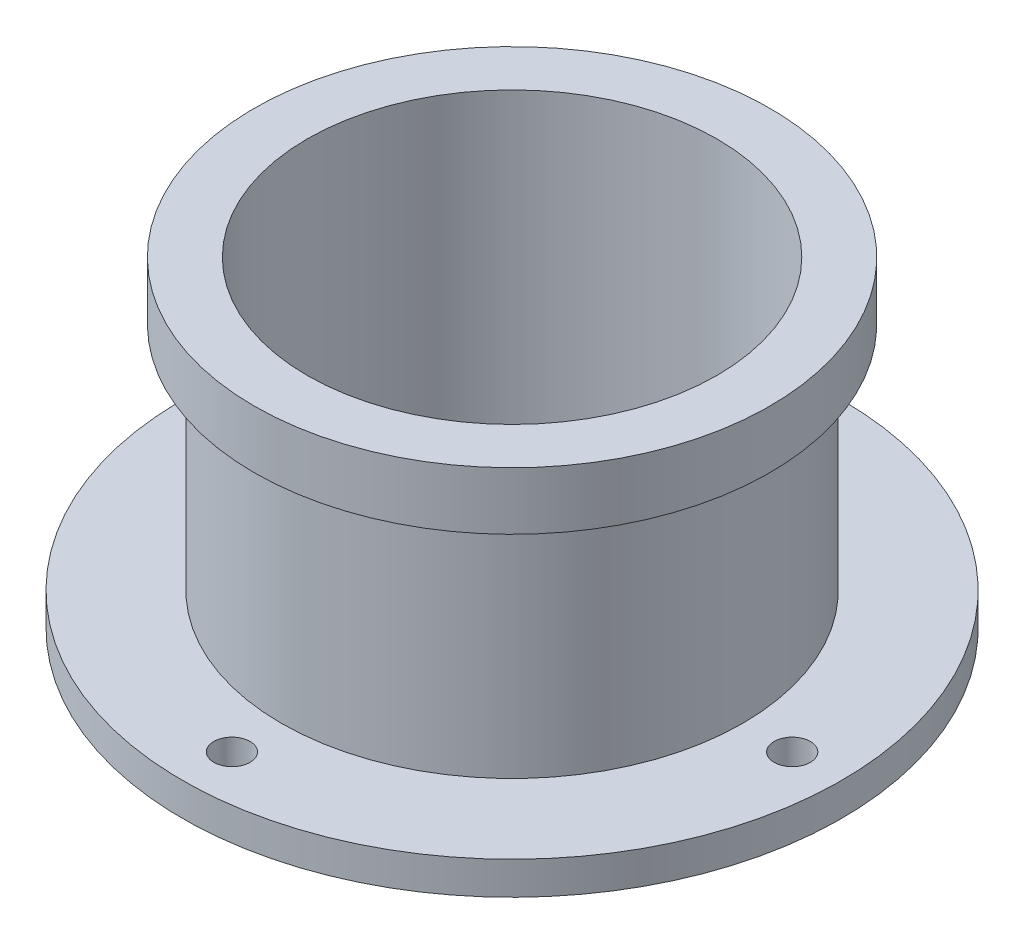
ISO-10303-21;
HEADER;
FILE_DESCRIPTION(('STEP AP214'),'2;1');
FILE_NAME('part.step','',(''),(''),'','','');
FILE_SCHEMA(('AUTOMOTIVE_DESIGN { 1 0 10303 214 1 1 1 1 }'));
ENDSEC;
DATA;
#1=APPLICATION_CONTEXT('core data for automotive mechanical design processes');
#2=APPLICATION_PROTOCOL_DEFINITION('international standard','automotive_design',2000,#1);
#3=PRODUCT_CONTEXT('',#1,'mechanical');
#4=PRODUCT('Part','Part','',(#3));
#5=PRODUCT_RELATED_PRODUCT_CATEGORY('part','',(#4));
#6=PRODUCT_DEFINITION_FORMATION('','',#4);
#7=PRODUCT_DEFINITION_CONTEXT('part definition',#1,'design');
#8=PRODUCT_DEFINITION('design','',#6,#7);
#9=PRODUCT_DEFINITION_SHAPE('','',#8);
#10=(LENGTH_UNIT() NAMED_UNIT(*) SI_UNIT(.MILLI.,.METRE.));
#11=(NAMED_UNIT(*) PLANE_ANGLE_UNIT() SI_UNIT($,.RADIAN.));
#12=(NAMED_UNIT(*) SI_UNIT($,.STERADIAN.) SOLID_ANGLE_UNIT());
#13=UNCERTAINTY_MEASURE_WITH_UNIT(LENGTH_MEASURE(1.E-05),#10,'distance_accuracy_value','');
#14=(GEOMETRIC_REPRESENTATION_CONTEXT(3) GLOBAL_UNCERTAINTY_ASSIGNED_CONTEXT((#13)) GLOBAL_UNIT_ASSIGNED_CONTEXT((#10,
#11,#12)) REPRESENTATION_CONTEXT('',''));
#15=CARTESIAN_POINT('',(0.,0.,0.));
#16=DIRECTION('',(0.,0.,1.));
#17=DIRECTION('',(1.,0.,0.));
#18=AXIS2_PLACEMENT_3D('',#15,#16,#17);
#19=CARTESIAN_POINT('',(0.,9.,0.));
#20=DIRECTION('',(0.,-1.,0.));
#21=DIRECTION('',(0.,0.,-1.));
#22=AXIS2_PLACEMENT_3D('',#19,#20,#21);
#23=CYLINDRICAL_SURFACE('',#22,31.0832015946794);
#24=CARTESIAN_POINT('',(0.,8.75,0.));
#25=DIRECTION('',(0.,1.,0.));
#26=DIRECTION('',(0.,0.,1.));
#27=AXIS2_PLACEMENT_3D('',#24,#25,#26);
#28=CIRCLE('',#27,31.0832015946794);
#29=CARTESIAN_POINT('',(0.,8.75,31.0832015946794));
#30=VERTEX_POINT('',#29);
#31=EDGE_CURVE('E73',#30,#30,#28,.T.);
#32=ORIENTED_EDGE('',*,*,#31,.T.);
#33=EDGE_LOOP('',(#32));
#34=FACE_BOUND('',#33,.T.);
#35=CARTESIAN_POINT('',(0.,-40.,0.));
#36=DIRECTION('',(0.,1.,0.));
#37=DIRECTION('',(0.,0.,1.));
#38=AXIS2_PLACEMENT_3D('',#35,#36,#37);
#39=CIRCLE('',#38,31.0832015946794);
#40=CARTESIAN_POINT('',(0.,-40.,31.0832015946794));
#41=VERTEX_POINT('',#40);
#42=EDGE_CURVE('E164',#41,#41,#39,.T.);
#43=ORIENTED_EDGE('',*,*,#42,.F.);
#44=EDGE_LOOP('',(#43));
#45=FACE_BOUND('',#44,.T.);
#46=ADVANCED_FACE('F46',(#34,#45),#23,.F.);
#47=CARTESIAN_POINT('',(0.,-40.,0.));
#48=DIRECTION('',(0.,1.,0.));
#49=DIRECTION('',(0.,0.,1.));
#50=AXIS2_PLACEMENT_3D('',#47,#48,#49);
#51=CYLINDRICAL_SURFACE('',#50,35.);
#52=CARTESIAN_POINT('',(0.,0.,0.));
#53=DIRECTION('',(0.,-1.,0.));
#54=DIRECTION('',(0.,0.,-1.));
#55=AXIS2_PLACEMENT_3D('',#52,#53,#54);
#56=CIRCLE('',#55,35.);
#57=CARTESIAN_POINT('',(0.,0.,-35.));
#58=VERTEX_POINT('',#57);
#59=EDGE_CURVE('E54',#58,#58,#56,.T.);
#60=ORIENTED_EDGE('',*,*,#59,.T.);
#61=EDGE_LOOP('',(#60));
#62=FACE_BOUND('',#61,.T.);
#63=CARTESIAN_POINT('',(0.,-35.,0.));
#64=DIRECTION('',(0.,-1.,0.));
#65=DIRECTION('',(0.,0.,-1.));
#66=AXIS2_PLACEMENT_3D('',#63,#64,#65);
#67=CIRCLE('',#66,35.);
#68=CARTESIAN_POINT('',(0.,-35.,-35.));
#69=VERTEX_POINT('',#68);
#70=EDGE_CURVE('E10',#69,#69,#67,.T.);
#71=ORIENTED_EDGE('',*,*,#70,.F.);
#72=EDGE_LOOP('',(#71));
#73=FACE_BOUND('',#72,.T.);
#74=ADVANCED_FACE('F96',(#62,#73),#51,.T.);
#75=CARTESIAN_POINT('',(0.,8.75,0.));
#76=DIRECTION('',(0.,-1.,0.));
#77=DIRECTION('',(0.,0.,-1.));
#78=AXIS2_PLACEMENT_3D('',#75,#76,#77);
#79=CYLINDRICAL_SURFACE('',#78,39.125);
#80=CARTESIAN_POINT('',(0.,8.75,0.));
#81=DIRECTION('',(0.,1.,0.));
#82=DIRECTION('',(0.,0.,1.));
#83=AXIS2_PLACEMENT_3D('',#80,#81,#82);
#84=CIRCLE('',#83,39.125);
#85=CARTESIAN_POINT('',(0.,8.75,39.125));
#86=VERTEX_POINT('',#85);
#87=EDGE_CURVE('E60',#86,#86,#84,.T.);
#88=ORIENTED_EDGE('',*,*,#87,.F.);
#89=EDGE_LOOP('',(#88));
#90=FACE_BOUND('',#89,.T.);
#91=CARTESIAN_POINT('',(0.,0.,0.));
#92=DIRECTION('',(0.,1.,0.));
#93=DIRECTION('',(0.,0.,1.));
#94=AXIS2_PLACEMENT_3D('',#91,#92,#93);
#95=CIRCLE('',#94,39.125);
#96=CARTESIAN_POINT('',(0.,0.,39.125));
#97=VERTEX_POINT('',#96);
#98=EDGE_CURVE('E67',#97,#97,#95,.T.);
#99=ORIENTED_EDGE('',*,*,#98,.T.);
#100=EDGE_LOOP('',(#99));
#101=FACE_BOUND('',#100,.T.);
#102=ADVANCED_FACE('F48',(#90,#101),#79,.T.);
#103=CARTESIAN_POINT('',(0.,8.75,0.));
#104=DIRECTION('',(0.,1.,0.));
#105=DIRECTION('',(0.,0.,1.));
#106=AXIS2_PLACEMENT_3D('',#103,#104,#105);
#107=PLANE('',#106);
#108=ORIENTED_EDGE('',*,*,#31,.F.);
#109=EDGE_LOOP('',(#108));
#110=FACE_BOUND('',#109,.T.);
#111=ORIENTED_EDGE('',*,*,#87,.T.);
#112=EDGE_LOOP('',(#111));
#113=FACE_BOUND('',#112,.T.);
#114=ADVANCED_FACE('F84',(#110,#113),#107,.T.);
#115=CARTESIAN_POINT('',(0.,0.,0.));
#116=DIRECTION('',(0.,1.,0.));
#117=DIRECTION('',(0.,0.,1.));
#118=AXIS2_PLACEMENT_3D('',#115,#116,#117);
#119=PLANE('',#118);
#120=ORIENTED_EDGE('',*,*,#59,.F.);
#121=EDGE_LOOP('',(#120));
#122=FACE_BOUND('',#121,.T.);
#123=ORIENTED_EDGE('',*,*,#98,.F.);
#124=EDGE_LOOP('',(#123));
#125=FACE_BOUND('',#124,.T.);
#126=ADVANCED_FACE('F81',(#122,#125),#119,.F.);
#127=CARTESIAN_POINT('',(0.,-35.,0.));
#128=DIRECTION('',(0.,-1.,0.));
#129=DIRECTION('',(0.,0.,-1.));
#130=AXIS2_PLACEMENT_3D('',#127,#128,#129);
#131=PLANE('',#130);
#132=CARTESIAN_POINT('',(0.,-35.,-42.5));
#133=DIRECTION('',(0.,1.,0.));
#134=DIRECTION('',(0.,0.,1.));
#135=AXIS2_PLACEMENT_3D('',#132,#133,#134);
#136=CIRCLE('',#135,2.75);
#137=CARTESIAN_POINT('',(0.,-35.,-39.75));
#138=VERTEX_POINT('',#137);
#139=EDGE_CURVE('E134',#138,#138,#136,.T.);
#140=ORIENTED_EDGE('',*,*,#139,.F.);
#141=EDGE_LOOP('',(#140));
#142=FACE_BOUND('',#141,.T.);
#143=CARTESIAN_POINT('',(42.5000000000012,-35.,-1.20011552744761E-12));
#144=DIRECTION('',(0.,1.,0.));
#145=DIRECTION('',(0.,0.,1.));
#146=AXIS2_PLACEMENT_3D('',#143,#144,#145);
#147=CIRCLE('',#146,2.75000000000095);
#148=CARTESIAN_POINT('',(42.5000000000012,-35.,2.74999999999974));
#149=VERTEX_POINT('',#148);
#150=EDGE_CURVE('E136',#149,#149,#147,.T.);
#151=ORIENTED_EDGE('',*,*,#150,.F.);
#152=EDGE_LOOP('',(#151));
#153=FACE_BOUND('',#152,.T.);
#154=CARTESIAN_POINT('',(2.40023105489521E-12,-35.,42.5));
#155=DIRECTION('',(0.,1.,0.));
#156=DIRECTION('',(0.,0.,1.));
#157=AXIS2_PLACEMENT_3D('',#154,#155,#156);
#158=CIRCLE('',#157,2.75000000000258);
#159=CARTESIAN_POINT('',(2.40023105489521E-12,-35.,45.2500000000026));
#160=VERTEX_POINT('',#159);
#161=EDGE_CURVE('E149',#160,#160,#158,.T.);
#162=ORIENTED_EDGE('',*,*,#161,.F.);
#163=EDGE_LOOP('',(#162));
#164=FACE_BOUND('',#163,.T.);
#165=CARTESIAN_POINT('',(-42.4999999999988,-35.,1.20532027634398E-12));
#166=DIRECTION('',(0.,1.,0.));
#167=DIRECTION('',(0.,0.,1.));
#168=AXIS2_PLACEMENT_3D('',#165,#166,#167);
#169=CIRCLE('',#168,2.75000000000193);
#170=CARTESIAN_POINT('',(-42.4999999999988,-35.,2.75000000000314));
#171=VERTEX_POINT('',#170);
#172=EDGE_CURVE('E157',#171,#171,#169,.T.);
#173=ORIENTED_EDGE('',*,*,#172,.F.);
#174=EDGE_LOOP('',(#173));
#175=FACE_BOUND('',#174,.T.);
#176=ORIENTED_EDGE('',*,*,#70,.T.);
#177=EDGE_LOOP('',(#176));
#178=FACE_BOUND('',#177,.T.);
#179=CARTESIAN_POINT('',(0.,-35.,0.));
#180=DIRECTION('',(0.,-1.,0.));
#181=DIRECTION('',(0.,0.,-1.));
#182=AXIS2_PLACEMENT_3D('',#179,#180,#181);
#183=CIRCLE('',#182,50.);
#184=CARTESIAN_POINT('',(0.,-35.,-50.));
#185=VERTEX_POINT('',#184);
#186=EDGE_CURVE('E76',#185,#185,#183,.T.);
#187=ORIENTED_EDGE('',*,*,#186,.F.);
#188=EDGE_LOOP('',(#187));
#189=FACE_BOUND('',#188,.T.);
#190=ADVANCED_FACE('F83',(#142,#153,#164,#175,#178,#189),#131,.F.);
#191=CARTESIAN_POINT('',(0.,-35.,0.));
#192=DIRECTION('',(0.,-1.,0.));
#193=DIRECTION('',(0.,0.,-1.));
#194=AXIS2_PLACEMENT_3D('',#191,#192,#193);
#195=CYLINDRICAL_SURFACE('',#194,50.);
#196=ORIENTED_EDGE('',*,*,#186,.T.);
#197=EDGE_LOOP('',(#196));
#198=FACE_BOUND('',#197,.T.);
#199=CARTESIAN_POINT('',(0.,-40.,0.));
#200=DIRECTION('',(0.,-1.,0.));
#201=DIRECTION('',(0.,0.,-1.));
#202=AXIS2_PLACEMENT_3D('',#199,#200,#201);
#203=CIRCLE('',#202,50.);
#204=CARTESIAN_POINT('',(0.,-40.,-50.));
#205=VERTEX_POINT('',#204);
#206=EDGE_CURVE('E71',#205,#205,#203,.T.);
#207=ORIENTED_EDGE('',*,*,#206,.F.);
#208=EDGE_LOOP('',(#207));
#209=FACE_BOUND('',#208,.T.);
#210=ADVANCED_FACE('F90',(#198,#209),#195,.T.);
#211=CARTESIAN_POINT('',(0.,-40.,0.));
#212=DIRECTION('',(0.,-1.,0.));
#213=DIRECTION('',(0.,0.,-1.));
#214=AXIS2_PLACEMENT_3D('',#211,#212,#213);
#215=PLANE('',#214);
#216=ORIENTED_EDGE('',*,*,#42,.T.);
#217=EDGE_LOOP('',(#216));
#218=FACE_BOUND('',#217,.T.);
#219=CARTESIAN_POINT('',(0.,-40.,-42.5));
#220=DIRECTION('',(0.,1.,0.));
#221=DIRECTION('',(0.,0.,1.));
#222=AXIS2_PLACEMENT_3D('',#219,#220,#221);
#223=CIRCLE('',#222,2.75);
#224=CARTESIAN_POINT('',(0.,-40.,-39.75));
#225=VERTEX_POINT('',#224);
#226=EDGE_CURVE('E131',#225,#225,#223,.T.);
#227=ORIENTED_EDGE('',*,*,#226,.T.);
#228=EDGE_LOOP('',(#227));
#229=FACE_BOUND('',#228,.T.);
#230=CARTESIAN_POINT('',(42.5000000000012,-40.,-1.20011552744761E-12));
#231=DIRECTION('',(0.,1.,0.));
#232=DIRECTION('',(0.,0.,1.));
#233=AXIS2_PLACEMENT_3D('',#230,#231,#232);
#234=CIRCLE('',#233,2.75000000000095);
#235=CARTESIAN_POINT('',(42.5000000000012,-40.,2.74999999999974));
#236=VERTEX_POINT('',#235);
#237=EDGE_CURVE('E142',#236,#236,#234,.T.);
#238=ORIENTED_EDGE('',*,*,#237,.T.);
#239=EDGE_LOOP('',(#238));
#240=FACE_BOUND('',#239,.T.);
#241=CARTESIAN_POINT('',(2.40023105489521E-12,-40.,42.5));
#242=DIRECTION('',(0.,1.,0.));
#243=DIRECTION('',(0.,0.,1.));
#244=AXIS2_PLACEMENT_3D('',#241,#242,#243);
#245=CIRCLE('',#244,2.75000000000258);
#246=CARTESIAN_POINT('',(2.40023105489521E-12,-40.,45.2500000000026));
#247=VERTEX_POINT('',#246);
#248=EDGE_CURVE('E153',#247,#247,#245,.T.);
#249=ORIENTED_EDGE('',*,*,#248,.T.);
#250=EDGE_LOOP('',(#249));
#251=FACE_BOUND('',#250,.T.);
#252=CARTESIAN_POINT('',(-42.4999999999988,-40.,1.20532027634398E-12));
#253=DIRECTION('',(0.,1.,0.));
#254=DIRECTION('',(0.,0.,1.));
#255=AXIS2_PLACEMENT_3D('',#252,#253,#254);
#256=CIRCLE('',#255,2.75000000000193);
#257=CARTESIAN_POINT('',(-42.4999999999988,-40.,2.75000000000314));
#258=VERTEX_POINT('',#257);
#259=EDGE_CURVE('E161',#258,#258,#256,.T.);
#260=ORIENTED_EDGE('',*,*,#259,.T.);
#261=EDGE_LOOP('',(#260));
#262=FACE_BOUND('',#261,.T.);
#263=ORIENTED_EDGE('',*,*,#206,.T.);
#264=EDGE_LOOP('',(#263));
#265=FACE_BOUND('',#264,.T.);
#266=ADVANCED_FACE('F104',(#218,#229,#240,#251,#262,#265),#215,.T.);
#267=CARTESIAN_POINT('',(-42.4999999999988,-40.,1.20532027634398E-12));
#268=DIRECTION('',(0.,1.,0.));
#269=DIRECTION('',(0.,0.,1.));
#270=AXIS2_PLACEMENT_3D('',#267,#268,#269);
#271=CYLINDRICAL_SURFACE('',#270,2.75000000000193);
#272=ORIENTED_EDGE('',*,*,#259,.F.);
#273=EDGE_LOOP('',(#272));
#274=FACE_BOUND('',#273,.T.);
#275=ORIENTED_EDGE('',*,*,#172,.T.);
#276=EDGE_LOOP('',(#275));
#277=FACE_BOUND('',#276,.T.);
#278=ADVANCED_FACE('F107',(#274,#277),#271,.F.);
#279=CARTESIAN_POINT('',(2.40023105489521E-12,-40.,42.5));
#280=DIRECTION('',(0.,1.,0.));
#281=DIRECTION('',(0.,0.,1.));
#282=AXIS2_PLACEMENT_3D('',#279,#280,#281);
#283=CYLINDRICAL_SURFACE('',#282,2.75000000000258);
#284=ORIENTED_EDGE('',*,*,#248,.F.);
#285=EDGE_LOOP('',(#284));
#286=FACE_BOUND('',#285,.T.);
#287=ORIENTED_EDGE('',*,*,#161,.T.);
#288=EDGE_LOOP('',(#287));
#289=FACE_BOUND('',#288,.T.);
#290=ADVANCED_FACE('F114',(#286,#289),#283,.F.);
#291=CARTESIAN_POINT('',(42.5000000000012,-40.,-1.20011552744761E-12));
#292=DIRECTION('',(0.,1.,0.));
#293=DIRECTION('',(0.,0.,1.));
#294=AXIS2_PLACEMENT_3D('',#291,#292,#293);
#295=CYLINDRICAL_SURFACE('',#294,2.75000000000095);
#296=ORIENTED_EDGE('',*,*,#237,.F.);
#297=EDGE_LOOP('',(#296));
#298=FACE_BOUND('',#297,.T.);
#299=ORIENTED_EDGE('',*,*,#150,.T.);
#300=EDGE_LOOP('',(#299));
#301=FACE_BOUND('',#300,.T.);
#302=ADVANCED_FACE('F118',(#298,#301),#295,.F.);
#303=CARTESIAN_POINT('',(0.,-40.,-42.5));
#304=DIRECTION('',(0.,1.,0.));
#305=DIRECTION('',(0.,0.,1.));
#306=AXIS2_PLACEMENT_3D('',#303,#304,#305);
#307=CYLINDRICAL_SURFACE('',#306,2.75);
#308=ORIENTED_EDGE('',*,*,#226,.F.);
#309=EDGE_LOOP('',(#308));
#310=FACE_BOUND('',#309,.T.);
#311=ORIENTED_EDGE('',*,*,#139,.T.);
#312=EDGE_LOOP('',(#311));
#313=FACE_BOUND('',#312,.T.);
#314=ADVANCED_FACE('F122',(#310,#313),#307,.F.);
#315=CLOSED_SHELL('',(#46,#74,#102,#114,#126,#190,#210,#266,#278,#290,#302,#314));
#316=MANIFOLD_SOLID_BREP('B2',#315);
#317=ADVANCED_BREP_SHAPE_REPRESENTATION('',(#18,#316),#14);
#318=SHAPE_DEFINITION_REPRESENTATION(#9,#317);
ENDSEC;
END-ISO-10303-21;
